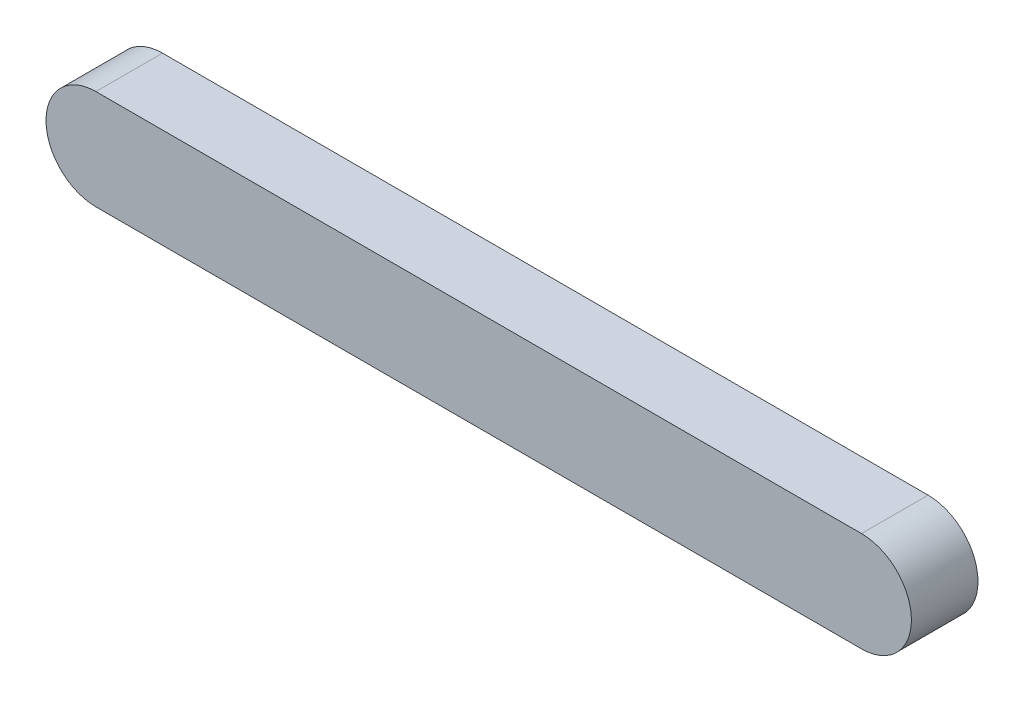
ISO-10303-21;
HEADER;
FILE_DESCRIPTION(('STEP AP214'),'2;1');
FILE_NAME('part.step','',(''),(''),'','','');
FILE_SCHEMA(('AUTOMOTIVE_DESIGN { 1 0 10303 214 1 1 1 1 }'));
ENDSEC;
DATA;
#1=APPLICATION_CONTEXT('core data for automotive mechanical design processes');
#2=APPLICATION_PROTOCOL_DEFINITION('international standard','automotive_design',2000,#1);
#3=PRODUCT_CONTEXT('',#1,'mechanical');
#4=PRODUCT('Part','Part','',(#3));
#5=PRODUCT_RELATED_PRODUCT_CATEGORY('part','',(#4));
#6=PRODUCT_DEFINITION_FORMATION('','',#4);
#7=PRODUCT_DEFINITION_CONTEXT('part definition',#1,'design');
#8=PRODUCT_DEFINITION('design','',#6,#7);
#9=PRODUCT_DEFINITION_SHAPE('','',#8);
#10=(LENGTH_UNIT() NAMED_UNIT(*) SI_UNIT(.MILLI.,.METRE.));
#11=(NAMED_UNIT(*) PLANE_ANGLE_UNIT() SI_UNIT($,.RADIAN.));
#12=(NAMED_UNIT(*) SI_UNIT($,.STERADIAN.) SOLID_ANGLE_UNIT());
#13=UNCERTAINTY_MEASURE_WITH_UNIT(LENGTH_MEASURE(1.E-05),#10,'distance_accuracy_value','');
#14=(GEOMETRIC_REPRESENTATION_CONTEXT(3) GLOBAL_UNCERTAINTY_ASSIGNED_CONTEXT((#13)) GLOBAL_UNIT_ASSIGNED_CONTEXT((#10,
#11,#12)) REPRESENTATION_CONTEXT('',''));
#15=CARTESIAN_POINT('',(0.,0.,0.));
#16=DIRECTION('',(0.,0.,1.));
#17=DIRECTION('',(1.,0.,0.));
#18=AXIS2_PLACEMENT_3D('',#15,#16,#17);
#19=CARTESIAN_POINT('',(115.,0.,10.));
#20=DIRECTION('',(0.,0.,-1.));
#21=DIRECTION('',(-1.,0.,0.));
#22=AXIS2_PLACEMENT_3D('',#19,#20,#21);
#23=CYLINDRICAL_SURFACE('',#22,7.5);
#24=CARTESIAN_POINT('',(115.,0.,0.));
#25=DIRECTION('',(0.,0.,1.));
#26=DIRECTION('',(1.,0.,0.));
#27=AXIS2_PLACEMENT_3D('',#24,#25,#26);
#28=CIRCLE('',#27,7.5);
#29=CARTESIAN_POINT('',(115.,-7.5,0.));
#30=VERTEX_POINT('',#29);
#31=CARTESIAN_POINT('',(115.,7.5,0.));
#32=VERTEX_POINT('',#31);
#33=EDGE_CURVE('E104',#30,#32,#28,.T.);
#34=ORIENTED_EDGE('',*,*,#33,.T.);
#35=DIRECTION('',(0.,0.,-1.));
#36=VECTOR('',#35,1.);
#37=CARTESIAN_POINT('',(115.,7.5,10.));
#38=LINE('',#37,#36);
#39=CARTESIAN_POINT('',(115.,7.5,10.));
#40=VERTEX_POINT('',#39);
#41=EDGE_CURVE('E11',#40,#32,#38,.T.);
#42=ORIENTED_EDGE('',*,*,#41,.F.);
#43=CARTESIAN_POINT('',(115.,0.,10.));
#44=DIRECTION('',(0.,0.,1.));
#45=DIRECTION('',(1.,0.,0.));
#46=AXIS2_PLACEMENT_3D('',#43,#44,#45);
#47=CIRCLE('',#46,7.5);
#48=CARTESIAN_POINT('',(115.,-7.5,10.));
#49=VERTEX_POINT('',#48);
#50=EDGE_CURVE('E92',#49,#40,#47,.T.);
#51=ORIENTED_EDGE('',*,*,#50,.F.);
#52=DIRECTION('',(0.,0.,-1.));
#53=VECTOR('',#52,1.);
#54=CARTESIAN_POINT('',(115.,-7.5,10.));
#55=LINE('',#54,#53);
#56=EDGE_CURVE('E100',#49,#30,#55,.T.);
#57=ORIENTED_EDGE('',*,*,#56,.T.);
#58=EDGE_LOOP('',(#34,#42,#51,#57));
#59=FACE_BOUND('',#58,.T.);
#60=ADVANCED_FACE('F41',(#59),#23,.T.);
#61=CARTESIAN_POINT('',(115.,7.5,10.));
#62=DIRECTION('',(0.,-1.,0.));
#63=DIRECTION('',(1.,0.,0.));
#64=AXIS2_PLACEMENT_3D('',#61,#62,#63);
#65=PLANE('',#64);
#66=DIRECTION('',(-1.,0.,0.));
#67=VECTOR('',#66,1.);
#68=CARTESIAN_POINT('',(115.,7.5,0.));
#69=LINE('',#68,#67);
#70=CARTESIAN_POINT('',(0.,7.5,0.));
#71=VERTEX_POINT('',#70);
#72=EDGE_CURVE('E96',#32,#71,#69,.T.);
#73=ORIENTED_EDGE('',*,*,#72,.T.);
#74=DIRECTION('',(0.,0.,-1.));
#75=VECTOR('',#74,1.);
#76=CARTESIAN_POINT('',(0.,7.5,10.));
#77=LINE('',#76,#75);
#78=CARTESIAN_POINT('',(0.,7.5,10.));
#79=VERTEX_POINT('',#78);
#80=EDGE_CURVE('E49',#79,#71,#77,.T.);
#81=ORIENTED_EDGE('',*,*,#80,.F.);
#82=DIRECTION('',(-1.,0.,0.));
#83=VECTOR('',#82,1.);
#84=CARTESIAN_POINT('',(115.,7.5,10.));
#85=LINE('',#84,#83);
#86=EDGE_CURVE('E87',#40,#79,#85,.T.);
#87=ORIENTED_EDGE('',*,*,#86,.F.);
#88=ORIENTED_EDGE('',*,*,#41,.T.);
#89=EDGE_LOOP('',(#73,#81,#87,#88));
#90=FACE_BOUND('',#89,.T.);
#91=ADVANCED_FACE('F95',(#90),#65,.F.);
#92=CARTESIAN_POINT('',(0.,0.,10.));
#93=DIRECTION('',(0.,0.,-1.));
#94=DIRECTION('',(-1.,0.,0.));
#95=AXIS2_PLACEMENT_3D('',#92,#93,#94);
#96=CYLINDRICAL_SURFACE('',#95,7.5);
#97=CARTESIAN_POINT('',(0.,0.,0.));
#98=DIRECTION('',(0.,0.,1.));
#99=DIRECTION('',(1.,0.,0.));
#100=AXIS2_PLACEMENT_3D('',#97,#98,#99);
#101=CIRCLE('',#100,7.5);
#102=CARTESIAN_POINT('',(0.,-7.5,0.));
#103=VERTEX_POINT('',#102);
#104=EDGE_CURVE('E74',#71,#103,#101,.T.);
#105=ORIENTED_EDGE('',*,*,#104,.T.);
#106=DIRECTION('',(0.,0.,-1.));
#107=VECTOR('',#106,1.);
#108=CARTESIAN_POINT('',(0.,-7.5,10.));
#109=LINE('',#108,#107);
#110=CARTESIAN_POINT('',(0.,-7.5,10.));
#111=VERTEX_POINT('',#110);
#112=EDGE_CURVE('E97',#111,#103,#109,.T.);
#113=ORIENTED_EDGE('',*,*,#112,.F.);
#114=CARTESIAN_POINT('',(0.,0.,10.));
#115=DIRECTION('',(0.,0.,1.));
#116=DIRECTION('',(1.,0.,0.));
#117=AXIS2_PLACEMENT_3D('',#114,#115,#116);
#118=CIRCLE('',#117,7.5);
#119=EDGE_CURVE('E90',#79,#111,#118,.T.);
#120=ORIENTED_EDGE('',*,*,#119,.F.);
#121=ORIENTED_EDGE('',*,*,#80,.T.);
#122=EDGE_LOOP('',(#105,#113,#120,#121));
#123=FACE_BOUND('',#122,.T.);
#124=ADVANCED_FACE('F98',(#123),#96,.T.);
#125=CARTESIAN_POINT('',(115.,-7.5,10.));
#126=DIRECTION('',(0.,1.,0.));
#127=DIRECTION('',(-1.,0.,0.));
#128=AXIS2_PLACEMENT_3D('',#125,#126,#127);
#129=PLANE('',#128);
#130=DIRECTION('',(1.,0.,0.));
#131=VECTOR('',#130,1.);
#132=CARTESIAN_POINT('',(115.,-7.5,0.));
#133=LINE('',#132,#131);
#134=EDGE_CURVE('E80',#103,#30,#133,.T.);
#135=ORIENTED_EDGE('',*,*,#134,.T.);
#136=ORIENTED_EDGE('',*,*,#56,.F.);
#137=DIRECTION('',(1.,0.,0.));
#138=VECTOR('',#137,1.);
#139=CARTESIAN_POINT('',(115.,-7.5,10.));
#140=LINE('',#139,#138);
#141=EDGE_CURVE('E57',#111,#49,#140,.T.);
#142=ORIENTED_EDGE('',*,*,#141,.F.);
#143=ORIENTED_EDGE('',*,*,#112,.T.);
#144=EDGE_LOOP('',(#135,#136,#142,#143));
#145=FACE_BOUND('',#144,.T.);
#146=ADVANCED_FACE('F111',(#145),#129,.F.);
#147=CARTESIAN_POINT('',(115.,0.,10.));
#148=DIRECTION('',(0.,0.,1.));
#149=DIRECTION('',(1.,0.,0.));
#150=AXIS2_PLACEMENT_3D('',#147,#148,#149);
#151=PLANE('',#150);
#152=ORIENTED_EDGE('',*,*,#50,.T.);
#153=ORIENTED_EDGE('',*,*,#86,.T.);
#154=ORIENTED_EDGE('',*,*,#119,.T.);
#155=ORIENTED_EDGE('',*,*,#141,.T.);
#156=EDGE_LOOP('',(#152,#153,#154,#155));
#157=FACE_BOUND('',#156,.T.);
#158=ADVANCED_FACE('F88',(#157),#151,.T.);
#159=CARTESIAN_POINT('',(115.,0.,0.));
#160=DIRECTION('',(0.,0.,1.));
#161=DIRECTION('',(1.,0.,0.));
#162=AXIS2_PLACEMENT_3D('',#159,#160,#161);
#163=PLANE('',#162);
#164=ORIENTED_EDGE('',*,*,#33,.F.);
#165=ORIENTED_EDGE('',*,*,#134,.F.);
#166=ORIENTED_EDGE('',*,*,#104,.F.);
#167=ORIENTED_EDGE('',*,*,#72,.F.);
#168=EDGE_LOOP('',(#164,#165,#166,#167));
#169=FACE_BOUND('',#168,.T.);
#170=ADVANCED_FACE('F114',(#169),#163,.F.);
#171=CLOSED_SHELL('',(#60,#91,#124,#146,#158,#170));
#172=MANIFOLD_SOLID_BREP('B2',#171);
#173=ADVANCED_BREP_SHAPE_REPRESENTATION('',(#18,#172),#14);
#174=SHAPE_DEFINITION_REPRESENTATION(#9,#173);
ENDSEC;
END-ISO-10303-21;
